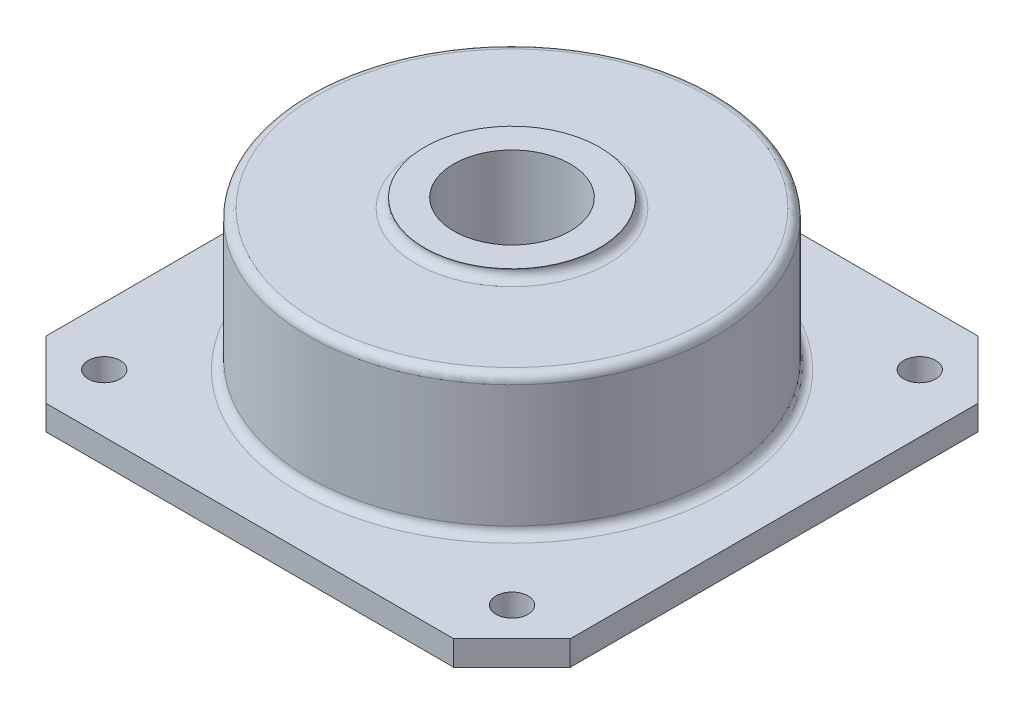
ISO-10303-21;
HEADER;
FILE_DESCRIPTION(('STEP AP214'),'2;1');
FILE_NAME('part.step','',(''),(''),'','','');
FILE_SCHEMA(('AUTOMOTIVE_DESIGN { 1 0 10303 214 1 1 1 1 }'));
ENDSEC;
DATA;
#1=APPLICATION_CONTEXT('core data for automotive mechanical design processes');
#2=APPLICATION_PROTOCOL_DEFINITION('international standard','automotive_design',2000,#1);
#3=PRODUCT_CONTEXT('',#1,'mechanical');
#4=PRODUCT('Part','Part','',(#3));
#5=PRODUCT_RELATED_PRODUCT_CATEGORY('part','',(#4));
#6=PRODUCT_DEFINITION_FORMATION('','',#4);
#7=PRODUCT_DEFINITION_CONTEXT('part definition',#1,'design');
#8=PRODUCT_DEFINITION('design','',#6,#7);
#9=PRODUCT_DEFINITION_SHAPE('','',#8);
#10=(LENGTH_UNIT() NAMED_UNIT(*) SI_UNIT(.MILLI.,.METRE.));
#11=(NAMED_UNIT(*) PLANE_ANGLE_UNIT() SI_UNIT($,.RADIAN.));
#12=(NAMED_UNIT(*) SI_UNIT($,.STERADIAN.) SOLID_ANGLE_UNIT());
#13=UNCERTAINTY_MEASURE_WITH_UNIT(LENGTH_MEASURE(1.E-05),#10,'distance_accuracy_value','');
#14=(GEOMETRIC_REPRESENTATION_CONTEXT(3) GLOBAL_UNCERTAINTY_ASSIGNED_CONTEXT((#13)) GLOBAL_UNIT_ASSIGNED_CONTEXT((#10,
#11,#12)) REPRESENTATION_CONTEXT('',''));
#15=CARTESIAN_POINT('',(0.,0.,0.));
#16=DIRECTION('',(0.,0.,1.));
#17=DIRECTION('',(1.,0.,0.));
#18=AXIS2_PLACEMENT_3D('',#15,#16,#17);
#19=CARTESIAN_POINT('',(0.,256.881765716657,0.));
#20=DIRECTION('',(0.,1.,0.));
#21=DIRECTION('',(0.,0.,1.));
#22=AXIS2_PLACEMENT_3D('',#19,#20,#21);
#23=PLANE('',#22);
#24=CARTESIAN_POINT('',(992.973468015764,256.881765716657,0.));
#25=DIRECTION('',(0.,-1.,0.));
#26=DIRECTION('',(0.,0.,-1.));
#27=AXIS2_PLACEMENT_3D('',#24,#25,#26);
#28=CIRCLE('',#27,20.);
#29=CARTESIAN_POINT('',(992.973468015764,256.881765716657,-20.));
#30=VERTEX_POINT('',#29);
#31=EDGE_CURVE('E218',#30,#30,#28,.T.);
#32=ORIENTED_EDGE('',*,*,#31,.F.);
#33=EDGE_LOOP('',(#32));
#34=FACE_BOUND('',#33,.T.);
#35=CARTESIAN_POINT('',(1062.97346801576,256.881765716657,-70.));
#36=DIRECTION('',(0.,1.,0.));
#37=DIRECTION('',(0.,0.,1.));
#38=AXIS2_PLACEMENT_3D('',#35,#36,#37);
#39=CIRCLE('',#38,5.50000000000007);
#40=CARTESIAN_POINT('',(1062.97346801576,256.881765716657,-64.4999999999999));
#41=VERTEX_POINT('',#40);
#42=EDGE_CURVE('E200',#41,#41,#39,.T.);
#43=ORIENTED_EDGE('',*,*,#42,.T.);
#44=EDGE_LOOP('',(#43));
#45=FACE_BOUND('',#44,.T.);
#46=CARTESIAN_POINT('',(1062.97346801576,256.881765716657,70.));
#47=DIRECTION('',(0.,-1.,0.));
#48=DIRECTION('',(0.,0.,-1.));
#49=AXIS2_PLACEMENT_3D('',#46,#47,#48);
#50=CIRCLE('',#49,5.50000000000007);
#51=CARTESIAN_POINT('',(1062.97346801576,256.881765716657,64.4999999999999));
#52=VERTEX_POINT('',#51);
#53=EDGE_CURVE('E189',#52,#52,#50,.T.);
#54=ORIENTED_EDGE('',*,*,#53,.F.);
#55=EDGE_LOOP('',(#54));
#56=FACE_BOUND('',#55,.T.);
#57=DIRECTION('',(0.,0.,-1.));
#58=VECTOR('',#57,1.);
#59=CARTESIAN_POINT('',(902.973468015764,256.881765716657,-90.));
#60=LINE('',#59,#58);
#61=CARTESIAN_POINT('',(902.973468015764,256.881765716657,69.9999999999998));
#62=VERTEX_POINT('',#61);
#63=CARTESIAN_POINT('',(902.973468015764,256.881765716657,-69.9999999999999));
#64=VERTEX_POINT('',#63);
#65=EDGE_CURVE('E193',#62,#64,#60,.T.);
#66=ORIENTED_EDGE('',*,*,#65,.T.);
#67=DIRECTION('',(-0.707106781186544,0.,0.707106781186551));
#68=VECTOR('',#67,1.);
#69=CARTESIAN_POINT('',(922.973468015764,256.881765716657,-90.));
#70=LINE('',#69,#68);
#71=CARTESIAN_POINT('',(922.973468015764,256.881765716657,-90.));
#72=VERTEX_POINT('',#71);
#73=EDGE_CURVE('E170',#64,#72,#70,.F.);
#74=ORIENTED_EDGE('',*,*,#73,.T.);
#75=DIRECTION('',(1.,0.,0.));
#76=VECTOR('',#75,1.);
#77=CARTESIAN_POINT('',(902.973468015764,256.881765716657,-90.));
#78=LINE('',#77,#76);
#79=CARTESIAN_POINT('',(1062.97346801576,256.881765716657,-90.));
#80=VERTEX_POINT('',#79);
#81=EDGE_CURVE('E120',#72,#80,#78,.T.);
#82=ORIENTED_EDGE('',*,*,#81,.T.);
#83=DIRECTION('',(-0.707106781186548,0.,-0.707106781186548));
#84=VECTOR('',#83,1.);
#85=CARTESIAN_POINT('',(1082.97346801576,256.881765716657,-70.));
#86=LINE('',#85,#84);
#87=CARTESIAN_POINT('',(1082.97346801576,256.881765716657,-70.));
#88=VERTEX_POINT('',#87);
#89=EDGE_CURVE('E168',#80,#88,#86,.F.);
#90=ORIENTED_EDGE('',*,*,#89,.T.);
#91=DIRECTION('',(0.,0.,1.));
#92=VECTOR('',#91,1.);
#93=CARTESIAN_POINT('',(1082.97346801576,256.881765716657,-90.));
#94=LINE('',#93,#92);
#95=CARTESIAN_POINT('',(1082.97346801576,256.881765716657,70.));
#96=VERTEX_POINT('',#95);
#97=EDGE_CURVE('E127',#88,#96,#94,.T.);
#98=ORIENTED_EDGE('',*,*,#97,.T.);
#99=DIRECTION('',(0.707106781186548,0.,-0.707106781186547));
#100=VECTOR('',#99,1.);
#101=CARTESIAN_POINT('',(1062.97346801576,256.881765716657,90.));
#102=LINE('',#101,#100);
#103=CARTESIAN_POINT('',(1062.97346801576,256.881765716657,90.));
#104=VERTEX_POINT('',#103);
#105=EDGE_CURVE('E55',#96,#104,#102,.F.);
#106=ORIENTED_EDGE('',*,*,#105,.T.);
#107=DIRECTION('',(-1.,0.,0.));
#108=VECTOR('',#107,1.);
#109=CARTESIAN_POINT('',(902.973468015764,256.881765716657,90.));
#110=LINE('',#109,#108);
#111=CARTESIAN_POINT('',(922.973468015764,256.881765716657,90.));
#112=VERTEX_POINT('',#111);
#113=EDGE_CURVE('E130',#104,#112,#110,.T.);
#114=ORIENTED_EDGE('',*,*,#113,.T.);
#115=DIRECTION('',(0.707106781186548,0.,0.707106781186548));
#116=VECTOR('',#115,1.);
#117=CARTESIAN_POINT('',(902.973468015764,256.881765716657,69.9999999999999));
#118=LINE('',#117,#116);
#119=EDGE_CURVE('E165',#112,#62,#118,.F.);
#120=ORIENTED_EDGE('',*,*,#119,.T.);
#121=EDGE_LOOP('',(#66,#74,#82,#90,#98,#106,#114,#120));
#122=FACE_BOUND('',#121,.T.);
#123=CARTESIAN_POINT('',(922.973468015764,256.881765716657,-70.));
#124=DIRECTION('',(0.,-1.,0.));
#125=DIRECTION('',(0.,0.,1.));
#126=AXIS2_PLACEMENT_3D('',#123,#124,#125);
#127=CIRCLE('',#126,5.50000000000007);
#128=CARTESIAN_POINT('',(922.973468015764,256.881765716657,-64.4999999999999));
#129=VERTEX_POINT('',#128);
#130=EDGE_CURVE('E206',#129,#129,#127,.T.);
#131=ORIENTED_EDGE('',*,*,#130,.F.);
#132=EDGE_LOOP('',(#131));
#133=FACE_BOUND('',#132,.T.);
#134=CARTESIAN_POINT('',(922.973468015764,256.881765716657,70.));
#135=DIRECTION('',(0.,1.,0.));
#136=DIRECTION('',(0.,0.,-1.));
#137=AXIS2_PLACEMENT_3D('',#134,#135,#136);
#138=CIRCLE('',#137,5.50000000000007);
#139=CARTESIAN_POINT('',(922.973468015764,256.881765716657,64.4999999999999));
#140=VERTEX_POINT('',#139);
#141=EDGE_CURVE('E212',#140,#140,#138,.T.);
#142=ORIENTED_EDGE('',*,*,#141,.T.);
#143=EDGE_LOOP('',(#142));
#144=FACE_BOUND('',#143,.T.);
#145=ADVANCED_FACE('F34',(#34,#45,#56,#122,#133,#144),#23,.F.);
#146=CARTESIAN_POINT('',(0.,265.381765716657,0.));
#147=DIRECTION('',(0.,1.,0.));
#148=DIRECTION('',(0.,0.,1.));
#149=AXIS2_PLACEMENT_3D('',#146,#147,#148);
#150=PLANE('',#149);
#151=CARTESIAN_POINT('',(1062.97346801576,265.381765716657,-70.));
#152=DIRECTION('',(0.,1.,0.));
#153=DIRECTION('',(0.,0.,1.));
#154=AXIS2_PLACEMENT_3D('',#151,#152,#153);
#155=CIRCLE('',#154,5.50000000000007);
#156=CARTESIAN_POINT('',(1062.97346801576,265.381765716657,-64.4999999999999));
#157=VERTEX_POINT('',#156);
#158=EDGE_CURVE('E198',#157,#157,#155,.T.);
#159=ORIENTED_EDGE('',*,*,#158,.F.);
#160=EDGE_LOOP('',(#159));
#161=FACE_BOUND('',#160,.T.);
#162=CARTESIAN_POINT('',(1062.97346801576,265.381765716657,70.));
#163=DIRECTION('',(0.,-1.,0.));
#164=DIRECTION('',(0.,0.,-1.));
#165=AXIS2_PLACEMENT_3D('',#162,#163,#164);
#166=CIRCLE('',#165,5.50000000000007);
#167=CARTESIAN_POINT('',(1062.97346801576,265.381765716657,64.4999999999999));
#168=VERTEX_POINT('',#167);
#169=EDGE_CURVE('E186',#168,#168,#166,.T.);
#170=ORIENTED_EDGE('',*,*,#169,.T.);
#171=EDGE_LOOP('',(#170));
#172=FACE_BOUND('',#171,.T.);
#173=CARTESIAN_POINT('',(992.973468015764,265.381765716657,0.));
#174=DIRECTION('',(0.,-1.,0.));
#175=DIRECTION('',(0.,0.,-1.));
#176=AXIS2_PLACEMENT_3D('',#173,#174,#175);
#177=CIRCLE('',#176,73.);
#178=CARTESIAN_POINT('',(992.973468015764,265.381765716657,-73.));
#179=VERTEX_POINT('',#178);
#180=EDGE_CURVE('E136',#179,#179,#177,.T.);
#181=ORIENTED_EDGE('',*,*,#180,.T.);
#182=EDGE_LOOP('',(#181));
#183=FACE_BOUND('',#182,.T.);
#184=DIRECTION('',(1.,0.,0.));
#185=VECTOR('',#184,1.);
#186=CARTESIAN_POINT('',(902.973468015764,265.381765716657,-90.));
#187=LINE('',#186,#185);
#188=CARTESIAN_POINT('',(922.973468015764,265.381765716657,-90.0000000000001));
#189=VERTEX_POINT('',#188);
#190=CARTESIAN_POINT('',(1062.97346801576,265.381765716657,-90.));
#191=VERTEX_POINT('',#190);
#192=EDGE_CURVE('E117',#189,#191,#187,.T.);
#193=ORIENTED_EDGE('',*,*,#192,.F.);
#194=DIRECTION('',(0.707106781186544,0.,-0.707106781186551));
#195=VECTOR('',#194,1.);
#196=CARTESIAN_POINT('',(416.486734007887,265.381765716657,416.486734007883));
#197=LINE('',#196,#195);
#198=CARTESIAN_POINT('',(902.973468015764,265.381765716657,-69.9999999999999));
#199=VERTEX_POINT('',#198);
#200=EDGE_CURVE('E100',#189,#199,#197,.F.);
#201=ORIENTED_EDGE('',*,*,#200,.T.);
#202=DIRECTION('',(0.,0.,-1.));
#203=VECTOR('',#202,1.);
#204=CARTESIAN_POINT('',(902.973468015764,265.381765716657,-90.));
#205=LINE('',#204,#203);
#206=CARTESIAN_POINT('',(902.973468015764,265.381765716657,69.9999999999999));
#207=VERTEX_POINT('',#206);
#208=EDGE_CURVE('E128',#207,#199,#205,.T.);
#209=ORIENTED_EDGE('',*,*,#208,.F.);
#210=DIRECTION('',(-0.707106781186548,0.,-0.707106781186548));
#211=VECTOR('',#210,1.);
#212=CARTESIAN_POINT('',(416.486734007882,265.381765716657,-416.486734007882));
#213=LINE('',#212,#211);
#214=CARTESIAN_POINT('',(922.973468015764,265.381765716657,90.));
#215=VERTEX_POINT('',#214);
#216=EDGE_CURVE('E121',#207,#215,#213,.F.);
#217=ORIENTED_EDGE('',*,*,#216,.T.);
#218=DIRECTION('',(-1.,0.,0.));
#219=VECTOR('',#218,1.);
#220=CARTESIAN_POINT('',(902.973468015764,265.381765716657,90.));
#221=LINE('',#220,#219);
#222=CARTESIAN_POINT('',(1062.97346801576,265.381765716657,90.));
#223=VERTEX_POINT('',#222);
#224=EDGE_CURVE('E132',#223,#215,#221,.T.);
#225=ORIENTED_EDGE('',*,*,#224,.F.);
#226=DIRECTION('',(-0.707106781186548,0.,0.707106781186547));
#227=VECTOR('',#226,1.);
#228=CARTESIAN_POINT('',(576.486734007881,265.381765716657,576.486734007882));
#229=LINE('',#228,#227);
#230=CARTESIAN_POINT('',(1082.97346801576,265.381765716657,70.));
#231=VERTEX_POINT('',#230);
#232=EDGE_CURVE('E159',#223,#231,#229,.F.);
#233=ORIENTED_EDGE('',*,*,#232,.T.);
#234=DIRECTION('',(0.,0.,1.));
#235=VECTOR('',#234,1.);
#236=CARTESIAN_POINT('',(1082.97346801576,265.381765716657,-90.));
#237=LINE('',#236,#235);
#238=CARTESIAN_POINT('',(1082.97346801576,265.381765716657,-69.9999999999997));
#239=VERTEX_POINT('',#238);
#240=EDGE_CURVE('E181',#239,#231,#237,.T.);
#241=ORIENTED_EDGE('',*,*,#240,.F.);
#242=DIRECTION('',(0.707106781186548,0.,0.707106781186548));
#243=VECTOR('',#242,1.);
#244=CARTESIAN_POINT('',(576.486734007882,265.381765716657,-576.486734007882));
#245=LINE('',#244,#243);
#246=EDGE_CURVE('E111',#239,#191,#245,.F.);
#247=ORIENTED_EDGE('',*,*,#246,.T.);
#248=EDGE_LOOP('',(#193,#201,#209,#217,#225,#233,#241,#247));
#249=FACE_BOUND('',#248,.T.);
#250=CARTESIAN_POINT('',(922.973468015764,265.381765716657,-70.));
#251=DIRECTION('',(0.,-1.,0.));
#252=DIRECTION('',(0.,0.,1.));
#253=AXIS2_PLACEMENT_3D('',#250,#251,#252);
#254=CIRCLE('',#253,5.50000000000007);
#255=CARTESIAN_POINT('',(922.973468015764,265.381765716657,-64.4999999999999));
#256=VERTEX_POINT('',#255);
#257=EDGE_CURVE('E203',#256,#256,#254,.T.);
#258=ORIENTED_EDGE('',*,*,#257,.T.);
#259=EDGE_LOOP('',(#258));
#260=FACE_BOUND('',#259,.T.);
#261=CARTESIAN_POINT('',(922.973468015764,265.381765716657,70.));
#262=DIRECTION('',(0.,1.,0.));
#263=DIRECTION('',(0.,0.,-1.));
#264=AXIS2_PLACEMENT_3D('',#261,#262,#263);
#265=CIRCLE('',#264,5.50000000000007);
#266=CARTESIAN_POINT('',(922.973468015764,265.381765716657,64.4999999999999));
#267=VERTEX_POINT('',#266);
#268=EDGE_CURVE('E209',#267,#267,#265,.T.);
#269=ORIENTED_EDGE('',*,*,#268,.F.);
#270=EDGE_LOOP('',(#269));
#271=FACE_BOUND('',#270,.T.);
#272=ADVANCED_FACE('F124',(#161,#172,#183,#249,#260,#271),#150,.T.);
#273=CARTESIAN_POINT('',(0.,316.581765716657,0.));
#274=DIRECTION('',(0.,1.,0.));
#275=DIRECTION('',(0.,0.,1.));
#276=AXIS2_PLACEMENT_3D('',#273,#274,#275);
#277=PLANE('',#276);
#278=CARTESIAN_POINT('',(992.973468015764,316.581765716657,0.));
#279=DIRECTION('',(0.,-1.,0.));
#280=DIRECTION('',(0.,0.,-1.));
#281=AXIS2_PLACEMENT_3D('',#278,#279,#280);
#282=CIRCLE('',#281,20.);
#283=CARTESIAN_POINT('',(992.973468015764,316.581765716657,-20.));
#284=VERTEX_POINT('',#283);
#285=EDGE_CURVE('E215',#284,#284,#282,.T.);
#286=ORIENTED_EDGE('',*,*,#285,.T.);
#287=EDGE_LOOP('',(#286));
#288=FACE_BOUND('',#287,.T.);
#289=CARTESIAN_POINT('',(992.973468015764,316.581765716657,0.));
#290=DIRECTION('',(0.,-1.,0.));
#291=DIRECTION('',(0.,0.,-1.));
#292=AXIS2_PLACEMENT_3D('',#289,#290,#291);
#293=CIRCLE('',#292,29.9999999999999);
#294=CARTESIAN_POINT('',(992.973468015764,316.581765716657,-29.9999999999999));
#295=VERTEX_POINT('',#294);
#296=EDGE_CURVE('E154',#295,#295,#293,.T.);
#297=ORIENTED_EDGE('',*,*,#296,.F.);
#298=EDGE_LOOP('',(#297));
#299=FACE_BOUND('',#298,.T.);
#300=ADVANCED_FACE('F224',(#288,#299),#277,.T.);
#301=CARTESIAN_POINT('',(992.973468015764,256.881765716657,0.));
#302=DIRECTION('',(0.,-1.,0.));
#303=DIRECTION('',(0.,0.,-1.));
#304=AXIS2_PLACEMENT_3D('',#301,#302,#303);
#305=CYLINDRICAL_SURFACE('',#304,29.9999999999999);
#306=ORIENTED_EDGE('',*,*,#296,.T.);
#307=EDGE_LOOP('',(#306));
#308=FACE_BOUND('',#307,.T.);
#309=CARTESIAN_POINT('',(992.973468015764,316.381765716657,0.));
#310=DIRECTION('',(0.,-1.,0.));
#311=DIRECTION('',(0.,0.,-1.));
#312=AXIS2_PLACEMENT_3D('',#309,#310,#311);
#313=CIRCLE('',#312,29.9999999999999);
#314=CARTESIAN_POINT('',(992.973468015764,316.381765716657,-29.9999999999999));
#315=VERTEX_POINT('',#314);
#316=EDGE_CURVE('E151',#315,#315,#313,.T.);
#317=ORIENTED_EDGE('',*,*,#316,.F.);
#318=EDGE_LOOP('',(#317));
#319=FACE_BOUND('',#318,.T.);
#320=ADVANCED_FACE('F297',(#308,#319),#305,.T.);
#321=CARTESIAN_POINT('',(992.973468015764,316.381765716657,0.));
#322=DIRECTION('',(0.,-1.,0.));
#323=DIRECTION('',(0.,0.,-1.));
#324=AXIS2_PLACEMENT_3D('',#321,#322,#323);
#325=TOROIDAL_SURFACE('',#324,32.9999999999999,3.);
#326=ORIENTED_EDGE('',*,*,#316,.T.);
#327=EDGE_LOOP('',(#326));
#328=FACE_BOUND('',#327,.T.);
#329=CARTESIAN_POINT('',(992.973468015764,313.381765716657,0.));
#330=DIRECTION('',(0.,-1.,0.));
#331=DIRECTION('',(0.,0.,-1.));
#332=AXIS2_PLACEMENT_3D('',#329,#330,#331);
#333=CIRCLE('',#332,32.9999999999999);
#334=CARTESIAN_POINT('',(992.973468015764,313.381765716657,-32.9999999999999));
#335=VERTEX_POINT('',#334);
#336=EDGE_CURVE('E148',#335,#335,#333,.T.);
#337=ORIENTED_EDGE('',*,*,#336,.F.);
#338=EDGE_LOOP('',(#337));
#339=FACE_BOUND('',#338,.T.);
#340=ADVANCED_FACE('F293',(#328,#339),#325,.F.);
#341=CARTESIAN_POINT('',(0.,313.381765716657,0.));
#342=DIRECTION('',(0.,-1.,0.));
#343=DIRECTION('',(0.,0.,-1.));
#344=AXIS2_PLACEMENT_3D('',#341,#342,#343);
#345=PLANE('',#344);
#346=CARTESIAN_POINT('',(992.973468015764,313.381765716657,0.));
#347=DIRECTION('',(0.,-1.,0.));
#348=DIRECTION('',(0.,0.,-1.));
#349=AXIS2_PLACEMENT_3D('',#346,#347,#348);
#350=CIRCLE('',#349,66.9999999999999);
#351=CARTESIAN_POINT('',(992.973468015764,313.381765716657,-66.9999999999999));
#352=VERTEX_POINT('',#351);
#353=EDGE_CURVE('E145',#352,#352,#350,.T.);
#354=ORIENTED_EDGE('',*,*,#353,.F.);
#355=EDGE_LOOP('',(#354));
#356=FACE_BOUND('',#355,.T.);
#357=ORIENTED_EDGE('',*,*,#336,.T.);
#358=EDGE_LOOP('',(#357));
#359=FACE_BOUND('',#358,.T.);
#360=ADVANCED_FACE('F289',(#356,#359),#345,.F.);
#361=CARTESIAN_POINT('',(992.973468015764,310.381765716657,0.));
#362=DIRECTION('',(0.,-1.,0.));
#363=DIRECTION('',(0.,0.,-1.));
#364=AXIS2_PLACEMENT_3D('',#361,#362,#363);
#365=TOROIDAL_SURFACE('',#364,66.9999999999999,3.);
#366=CARTESIAN_POINT('',(992.973468015764,310.381765716657,0.));
#367=DIRECTION('',(0.,-1.,0.));
#368=DIRECTION('',(0.,0.,-1.));
#369=AXIS2_PLACEMENT_3D('',#366,#367,#368);
#370=CIRCLE('',#369,70.);
#371=CARTESIAN_POINT('',(992.973468015764,310.381765716657,-70.));
#372=VERTEX_POINT('',#371);
#373=EDGE_CURVE('E142',#372,#372,#370,.T.);
#374=ORIENTED_EDGE('',*,*,#373,.F.);
#375=EDGE_LOOP('',(#374));
#376=FACE_BOUND('',#375,.T.);
#377=ORIENTED_EDGE('',*,*,#353,.T.);
#378=EDGE_LOOP('',(#377));
#379=FACE_BOUND('',#378,.T.);
#380=ADVANCED_FACE('F285',(#376,#379),#365,.T.);
#381=CARTESIAN_POINT('',(992.973468015764,256.881765716657,0.));
#382=DIRECTION('',(0.,-1.,0.));
#383=DIRECTION('',(0.,0.,-1.));
#384=AXIS2_PLACEMENT_3D('',#381,#382,#383);
#385=CYLINDRICAL_SURFACE('',#384,70.);
#386=ORIENTED_EDGE('',*,*,#373,.T.);
#387=EDGE_LOOP('',(#386));
#388=FACE_BOUND('',#387,.T.);
#389=CARTESIAN_POINT('',(992.973468015764,268.381765716657,0.));
#390=DIRECTION('',(0.,-1.,0.));
#391=DIRECTION('',(0.,0.,-1.));
#392=AXIS2_PLACEMENT_3D('',#389,#390,#391);
#393=CIRCLE('',#392,70.);
#394=CARTESIAN_POINT('',(992.973468015764,268.381765716657,-70.));
#395=VERTEX_POINT('',#394);
#396=EDGE_CURVE('E139',#395,#395,#393,.T.);
#397=ORIENTED_EDGE('',*,*,#396,.F.);
#398=EDGE_LOOP('',(#397));
#399=FACE_BOUND('',#398,.T.);
#400=ADVANCED_FACE('F281',(#388,#399),#385,.T.);
#401=CARTESIAN_POINT('',(992.973468015764,268.381765716657,0.));
#402=DIRECTION('',(0.,-1.,0.));
#403=DIRECTION('',(0.,0.,-1.));
#404=AXIS2_PLACEMENT_3D('',#401,#402,#403);
#405=TOROIDAL_SURFACE('',#404,73.,3.);
#406=ORIENTED_EDGE('',*,*,#396,.T.);
#407=EDGE_LOOP('',(#406));
#408=FACE_BOUND('',#407,.T.);
#409=ORIENTED_EDGE('',*,*,#180,.F.);
#410=EDGE_LOOP('',(#409));
#411=FACE_BOUND('',#410,.T.);
#412=ADVANCED_FACE('F278',(#408,#411),#405,.F.);
#413=CARTESIAN_POINT('',(1082.97346801576,256.881765716657,-90.));
#414=DIRECTION('',(-1.,0.,0.));
#415=DIRECTION('',(0.,0.,1.));
#416=AXIS2_PLACEMENT_3D('',#413,#414,#415);
#417=PLANE('',#416);
#418=ORIENTED_EDGE('',*,*,#97,.F.);
#419=DIRECTION('',(0.,1.,0.));
#420=VECTOR('',#419,1.);
#421=CARTESIAN_POINT('',(1082.97346801576,256.881765716657,-70.));
#422=LINE('',#421,#420);
#423=EDGE_CURVE('E174',#88,#239,#422,.T.);
#424=ORIENTED_EDGE('',*,*,#423,.T.);
#425=ORIENTED_EDGE('',*,*,#240,.T.);
#426=DIRECTION('',(0.,-1.,0.));
#427=VECTOR('',#426,1.);
#428=CARTESIAN_POINT('',(1082.97346801576,256.881765716657,70.));
#429=LINE('',#428,#427);
#430=EDGE_CURVE('E172',#231,#96,#429,.T.);
#431=ORIENTED_EDGE('',*,*,#430,.T.);
#432=EDGE_LOOP('',(#418,#424,#425,#431));
#433=FACE_BOUND('',#432,.T.);
#434=ADVANCED_FACE('F180',(#433),#417,.F.);
#435=CARTESIAN_POINT('',(902.973468015764,256.881765716657,90.));
#436=DIRECTION('',(0.,0.,-1.));
#437=DIRECTION('',(-1.,0.,0.));
#438=AXIS2_PLACEMENT_3D('',#435,#436,#437);
#439=PLANE('',#438);
#440=ORIENTED_EDGE('',*,*,#113,.F.);
#441=DIRECTION('',(0.,1.,0.));
#442=VECTOR('',#441,1.);
#443=CARTESIAN_POINT('',(1062.97346801576,256.881765716657,90.));
#444=LINE('',#443,#442);
#445=EDGE_CURVE('E11',#104,#223,#444,.T.);
#446=ORIENTED_EDGE('',*,*,#445,.T.);
#447=ORIENTED_EDGE('',*,*,#224,.T.);
#448=DIRECTION('',(0.,-1.,0.));
#449=VECTOR('',#448,1.);
#450=CARTESIAN_POINT('',(922.973468015764,256.881765716657,90.));
#451=LINE('',#450,#449);
#452=EDGE_CURVE('E42',#215,#112,#451,.T.);
#453=ORIENTED_EDGE('',*,*,#452,.T.);
#454=EDGE_LOOP('',(#440,#446,#447,#453));
#455=FACE_BOUND('',#454,.T.);
#456=ADVANCED_FACE('F272',(#455),#439,.F.);
#457=CARTESIAN_POINT('',(902.973468015764,256.881765716657,-90.));
#458=DIRECTION('',(1.,0.,0.));
#459=DIRECTION('',(0.,0.,-1.));
#460=AXIS2_PLACEMENT_3D('',#457,#458,#459);
#461=PLANE('',#460);
#462=ORIENTED_EDGE('',*,*,#208,.T.);
#463=DIRECTION('',(0.,-1.,0.));
#464=VECTOR('',#463,1.);
#465=CARTESIAN_POINT('',(902.973468015764,256.881765716657,-69.9999999999999));
#466=LINE('',#465,#464);
#467=EDGE_CURVE('E105',#199,#64,#466,.T.);
#468=ORIENTED_EDGE('',*,*,#467,.T.);
#469=ORIENTED_EDGE('',*,*,#65,.F.);
#470=DIRECTION('',(0.,1.,0.));
#471=VECTOR('',#470,1.);
#472=CARTESIAN_POINT('',(902.973468015764,256.881765716657,69.9999999999999));
#473=LINE('',#472,#471);
#474=EDGE_CURVE('E110',#62,#207,#473,.T.);
#475=ORIENTED_EDGE('',*,*,#474,.T.);
#476=EDGE_LOOP('',(#462,#468,#469,#475));
#477=FACE_BOUND('',#476,.T.);
#478=ADVANCED_FACE('F269',(#477),#461,.F.);
#479=CARTESIAN_POINT('',(902.973468015764,256.881765716657,-90.));
#480=DIRECTION('',(0.,0.,1.));
#481=DIRECTION('',(1.,0.,0.));
#482=AXIS2_PLACEMENT_3D('',#479,#480,#481);
#483=PLANE('',#482);
#484=ORIENTED_EDGE('',*,*,#81,.F.);
#485=DIRECTION('',(0.,1.,0.));
#486=VECTOR('',#485,1.);
#487=CARTESIAN_POINT('',(922.973468015764,256.881765716657,-90.));
#488=LINE('',#487,#486);
#489=EDGE_CURVE('E104',#72,#189,#488,.T.);
#490=ORIENTED_EDGE('',*,*,#489,.T.);
#491=ORIENTED_EDGE('',*,*,#192,.T.);
#492=DIRECTION('',(0.,-1.,0.));
#493=VECTOR('',#492,1.);
#494=CARTESIAN_POINT('',(1062.97346801576,256.881765716657,-90.));
#495=LINE('',#494,#493);
#496=EDGE_CURVE('E122',#191,#80,#495,.T.);
#497=ORIENTED_EDGE('',*,*,#496,.T.);
#498=EDGE_LOOP('',(#484,#490,#491,#497));
#499=FACE_BOUND('',#498,.T.);
#500=ADVANCED_FACE('F116',(#499),#483,.F.);
#501=CARTESIAN_POINT('',(922.973468015764,256.881765716657,-90.));
#502=DIRECTION('',(0.707106781186551,0.,0.707106781186544));
#503=DIRECTION('',(0.,1.,0.));
#504=AXIS2_PLACEMENT_3D('',#501,#502,#503);
#505=PLANE('',#504);
#506=ORIENTED_EDGE('',*,*,#73,.F.);
#507=ORIENTED_EDGE('',*,*,#467,.F.);
#508=ORIENTED_EDGE('',*,*,#200,.F.);
#509=ORIENTED_EDGE('',*,*,#489,.F.);
#510=EDGE_LOOP('',(#506,#507,#508,#509));
#511=FACE_BOUND('',#510,.T.);
#512=ADVANCED_FACE('F103',(#511),#505,.F.);
#513=CARTESIAN_POINT('',(1082.97346801576,256.881765716657,-70.));
#514=DIRECTION('',(-0.707106781186547,0.,0.707106781186547));
#515=DIRECTION('',(0.,1.,0.));
#516=AXIS2_PLACEMENT_3D('',#513,#514,#515);
#517=PLANE('',#516);
#518=ORIENTED_EDGE('',*,*,#89,.F.);
#519=ORIENTED_EDGE('',*,*,#496,.F.);
#520=ORIENTED_EDGE('',*,*,#246,.F.);
#521=ORIENTED_EDGE('',*,*,#423,.F.);
#522=EDGE_LOOP('',(#518,#519,#520,#521));
#523=FACE_BOUND('',#522,.T.);
#524=ADVANCED_FACE('F306',(#523),#517,.F.);
#525=CARTESIAN_POINT('',(1062.97346801576,256.881765716657,90.));
#526=DIRECTION('',(-0.707106781186547,0.,-0.707106781186548));
#527=DIRECTION('',(0.,1.,0.));
#528=AXIS2_PLACEMENT_3D('',#525,#526,#527);
#529=PLANE('',#528);
#530=ORIENTED_EDGE('',*,*,#105,.F.);
#531=ORIENTED_EDGE('',*,*,#430,.F.);
#532=ORIENTED_EDGE('',*,*,#232,.F.);
#533=ORIENTED_EDGE('',*,*,#445,.F.);
#534=EDGE_LOOP('',(#530,#531,#532,#533));
#535=FACE_BOUND('',#534,.T.);
#536=ADVANCED_FACE('F308',(#535),#529,.F.);
#537=CARTESIAN_POINT('',(902.973468015764,256.881765716657,69.9999999999999));
#538=DIRECTION('',(0.707106781186547,0.,-0.707106781186547));
#539=DIRECTION('',(0.,1.,0.));
#540=AXIS2_PLACEMENT_3D('',#537,#538,#539);
#541=PLANE('',#540);
#542=ORIENTED_EDGE('',*,*,#119,.F.);
#543=ORIENTED_EDGE('',*,*,#452,.F.);
#544=ORIENTED_EDGE('',*,*,#216,.F.);
#545=ORIENTED_EDGE('',*,*,#474,.F.);
#546=EDGE_LOOP('',(#542,#543,#544,#545));
#547=FACE_BOUND('',#546,.T.);
#548=ADVANCED_FACE('F36',(#547),#541,.F.);
#549=CARTESIAN_POINT('',(1062.97346801576,265.381765716657,70.));
#550=DIRECTION('',(0.,-1.,0.));
#551=DIRECTION('',(0.,0.,-1.));
#552=AXIS2_PLACEMENT_3D('',#549,#550,#551);
#553=CYLINDRICAL_SURFACE('',#552,5.50000000000007);
#554=ORIENTED_EDGE('',*,*,#169,.F.);
#555=EDGE_LOOP('',(#554));
#556=FACE_BOUND('',#555,.T.);
#557=ORIENTED_EDGE('',*,*,#53,.T.);
#558=EDGE_LOOP('',(#557));
#559=FACE_BOUND('',#558,.T.);
#560=ADVANCED_FACE('F259',(#556,#559),#553,.F.);
#561=CARTESIAN_POINT('',(1062.97346801576,265.381765716657,-70.));
#562=DIRECTION('',(0.,-1.,0.));
#563=DIRECTION('',(0.,0.,-1.));
#564=AXIS2_PLACEMENT_3D('',#561,#562,#563);
#565=CYLINDRICAL_SURFACE('',#564,5.50000000000007);
#566=ORIENTED_EDGE('',*,*,#158,.T.);
#567=EDGE_LOOP('',(#566));
#568=FACE_BOUND('',#567,.T.);
#569=ORIENTED_EDGE('',*,*,#42,.F.);
#570=EDGE_LOOP('',(#569));
#571=FACE_BOUND('',#570,.T.);
#572=ADVANCED_FACE('F253',(#568,#571),#565,.F.);
#573=CARTESIAN_POINT('',(922.973468015764,265.381765716657,-70.));
#574=DIRECTION('',(0.,-1.,0.));
#575=DIRECTION('',(0.,0.,-1.));
#576=AXIS2_PLACEMENT_3D('',#573,#574,#575);
#577=CYLINDRICAL_SURFACE('',#576,5.50000000000007);
#578=ORIENTED_EDGE('',*,*,#257,.F.);
#579=EDGE_LOOP('',(#578));
#580=FACE_BOUND('',#579,.T.);
#581=ORIENTED_EDGE('',*,*,#130,.T.);
#582=EDGE_LOOP('',(#581));
#583=FACE_BOUND('',#582,.T.);
#584=ADVANCED_FACE('F247',(#580,#583),#577,.F.);
#585=CARTESIAN_POINT('',(922.973468015764,265.381765716657,70.));
#586=DIRECTION('',(0.,-1.,0.));
#587=DIRECTION('',(0.,0.,-1.));
#588=AXIS2_PLACEMENT_3D('',#585,#586,#587);
#589=CYLINDRICAL_SURFACE('',#588,5.50000000000007);
#590=ORIENTED_EDGE('',*,*,#268,.T.);
#591=EDGE_LOOP('',(#590));
#592=FACE_BOUND('',#591,.T.);
#593=ORIENTED_EDGE('',*,*,#141,.F.);
#594=EDGE_LOOP('',(#593));
#595=FACE_BOUND('',#594,.T.);
#596=ADVANCED_FACE('F230',(#592,#595),#589,.F.);
#597=CARTESIAN_POINT('',(992.973468015764,316.581765716657,0.));
#598=DIRECTION('',(0.,-1.,0.));
#599=DIRECTION('',(0.,0.,-1.));
#600=AXIS2_PLACEMENT_3D('',#597,#598,#599);
#601=CYLINDRICAL_SURFACE('',#600,20.);
#602=ORIENTED_EDGE('',*,*,#285,.F.);
#603=EDGE_LOOP('',(#602));
#604=FACE_BOUND('',#603,.T.);
#605=ORIENTED_EDGE('',*,*,#31,.T.);
#606=EDGE_LOOP('',(#605));
#607=FACE_BOUND('',#606,.T.);
#608=ADVANCED_FACE('F227',(#604,#607),#601,.F.);
#609=CLOSED_SHELL('',(#145,#272,#300,#320,#340,#360,#380,#400,#412,#434,#456,#478,#500,#512,
#524,#536,#548,#560,#572,#584,#596,#608));
#610=MANIFOLD_SOLID_BREP('B2',#609);
#611=ADVANCED_BREP_SHAPE_REPRESENTATION('',(#18,#610),#14);
#612=SHAPE_DEFINITION_REPRESENTATION(#9,#611);
ENDSEC;
END-ISO-10303-21;
